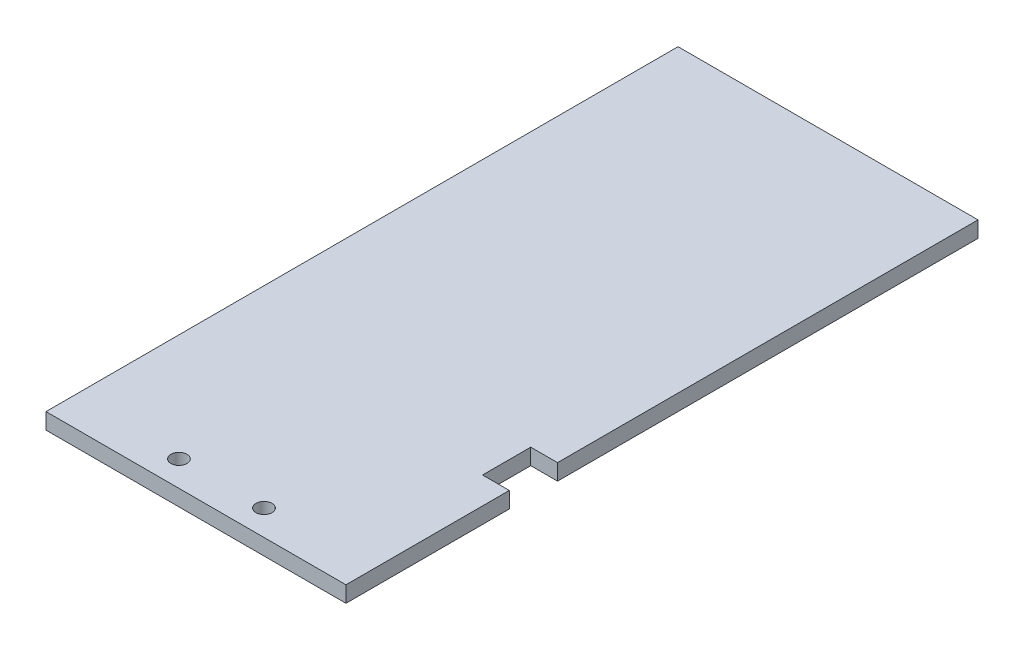
ISO-10303-21;
HEADER;
FILE_DESCRIPTION(('STEP AP214'),'2;1');
FILE_NAME('part.step','',(''),(''),'','','');
FILE_SCHEMA(('AUTOMOTIVE_DESIGN { 1 0 10303 214 1 1 1 1 }'));
ENDSEC;
DATA;
#1=APPLICATION_CONTEXT('core data for automotive mechanical design processes');
#2=APPLICATION_PROTOCOL_DEFINITION('international standard','automotive_design',2000,#1);
#3=PRODUCT_CONTEXT('',#1,'mechanical');
#4=PRODUCT('Part','Part','',(#3));
#5=PRODUCT_RELATED_PRODUCT_CATEGORY('part','',(#4));
#6=PRODUCT_DEFINITION_FORMATION('','',#4);
#7=PRODUCT_DEFINITION_CONTEXT('part definition',#1,'design');
#8=PRODUCT_DEFINITION('design','',#6,#7);
#9=PRODUCT_DEFINITION_SHAPE('','',#8);
#10=(LENGTH_UNIT() NAMED_UNIT(*) SI_UNIT(.MILLI.,.METRE.));
#11=(NAMED_UNIT(*) PLANE_ANGLE_UNIT() SI_UNIT($,.RADIAN.));
#12=(NAMED_UNIT(*) SI_UNIT($,.STERADIAN.) SOLID_ANGLE_UNIT());
#13=UNCERTAINTY_MEASURE_WITH_UNIT(LENGTH_MEASURE(1.E-05),#10,'distance_accuracy_value','');
#14=(GEOMETRIC_REPRESENTATION_CONTEXT(3) GLOBAL_UNCERTAINTY_ASSIGNED_CONTEXT((#13)) GLOBAL_UNIT_ASSIGNED_CONTEXT((#10,
#11,#12)) REPRESENTATION_CONTEXT('',''));
#15=CARTESIAN_POINT('',(0.,0.,0.));
#16=DIRECTION('',(0.,0.,1.));
#17=DIRECTION('',(1.,0.,0.));
#18=AXIS2_PLACEMENT_3D('',#15,#16,#17);
#19=CARTESIAN_POINT('',(56.,3.,0.));
#20=DIRECTION('',(-1.,0.,0.));
#21=DIRECTION('',(0.,0.,1.));
#22=AXIS2_PLACEMENT_3D('',#19,#20,#21);
#23=PLANE('',#22);
#24=DIRECTION('',(0.,0.,-1.));
#25=VECTOR('',#24,1.);
#26=CARTESIAN_POINT('',(56.,3.,0.));
#27=LINE('',#26,#25);
#28=CARTESIAN_POINT('',(56.,3.,-19.5));
#29=VERTEX_POINT('',#28);
#30=CARTESIAN_POINT('',(56.,3.,-98.));
#31=VERTEX_POINT('',#30);
#32=EDGE_CURVE('E151',#29,#31,#27,.T.);
#33=ORIENTED_EDGE('',*,*,#32,.F.);
#34=DIRECTION('',(0.,1.,0.));
#35=VECTOR('',#34,1.);
#36=CARTESIAN_POINT('',(56.,-7.,-19.5));
#37=LINE('',#36,#35);
#38=CARTESIAN_POINT('',(56.,0.,-19.5));
#39=VERTEX_POINT('',#38);
#40=EDGE_CURVE('E141',#39,#29,#37,.T.);
#41=ORIENTED_EDGE('',*,*,#40,.F.);
#42=DIRECTION('',(0.,0.,-1.));
#43=VECTOR('',#42,1.);
#44=CARTESIAN_POINT('',(56.,0.,0.));
#45=LINE('',#44,#43);
#46=CARTESIAN_POINT('',(56.,0.,-98.));
#47=VERTEX_POINT('',#46);
#48=EDGE_CURVE('E99',#39,#47,#45,.T.);
#49=ORIENTED_EDGE('',*,*,#48,.T.);
#50=DIRECTION('',(0.,-1.,0.));
#51=VECTOR('',#50,1.);
#52=CARTESIAN_POINT('',(56.,3.,-98.));
#53=LINE('',#52,#51);
#54=EDGE_CURVE('E79',#31,#47,#53,.T.);
#55=ORIENTED_EDGE('',*,*,#54,.F.);
#56=EDGE_LOOP('',(#33,#41,#49,#55));
#57=FACE_BOUND('',#56,.T.);
#58=ADVANCED_FACE('F34',(#57),#23,.F.);
#59=CARTESIAN_POINT('',(0.,3.,0.));
#60=DIRECTION('',(1.,0.,0.));
#61=DIRECTION('',(0.,0.,-1.));
#62=AXIS2_PLACEMENT_3D('',#59,#60,#61);
#63=PLANE('',#62);
#64=DIRECTION('',(0.,0.,1.));
#65=VECTOR('',#64,1.);
#66=CARTESIAN_POINT('',(0.,0.,0.));
#67=LINE('',#66,#65);
#68=CARTESIAN_POINT('',(0.,0.,-98.));
#69=VERTEX_POINT('',#68);
#70=CARTESIAN_POINT('',(0.,0.,20.));
#71=VERTEX_POINT('',#70);
#72=EDGE_CURVE('E90',#69,#71,#67,.T.);
#73=ORIENTED_EDGE('',*,*,#72,.T.);
#74=DIRECTION('',(0.,-1.,0.));
#75=VECTOR('',#74,1.);
#76=CARTESIAN_POINT('',(0.,0.,20.));
#77=LINE('',#76,#75);
#78=CARTESIAN_POINT('',(0.,3.,20.));
#79=VERTEX_POINT('',#78);
#80=EDGE_CURVE('E140',#79,#71,#77,.T.);
#81=ORIENTED_EDGE('',*,*,#80,.F.);
#82=DIRECTION('',(0.,0.,1.));
#83=VECTOR('',#82,1.);
#84=CARTESIAN_POINT('',(0.,3.,0.));
#85=LINE('',#84,#83);
#86=CARTESIAN_POINT('',(0.,3.,-98.));
#87=VERTEX_POINT('',#86);
#88=EDGE_CURVE('E83',#87,#79,#85,.T.);
#89=ORIENTED_EDGE('',*,*,#88,.F.);
#90=DIRECTION('',(0.,-1.,0.));
#91=VECTOR('',#90,1.);
#92=CARTESIAN_POINT('',(0.,3.,-98.));
#93=LINE('',#92,#91);
#94=EDGE_CURVE('E76',#87,#69,#93,.T.);
#95=ORIENTED_EDGE('',*,*,#94,.T.);
#96=EDGE_LOOP('',(#73,#81,#89,#95));
#97=FACE_BOUND('',#96,.T.);
#98=ADVANCED_FACE('F36',(#97),#63,.F.);
#99=CARTESIAN_POINT('',(56.,0.,20.));
#100=VERTEX_POINT('',#99);
#101=CARTESIAN_POINT('',(56.,0.,-10.5));
#102=VERTEX_POINT('',#101);
#103=EDGE_CURVE('E84',#100,#102,#45,.T.);
#104=ORIENTED_EDGE('',*,*,#103,.T.);
#105=DIRECTION('',(0.,1.,0.));
#106=VECTOR('',#105,1.);
#107=CARTESIAN_POINT('',(56.,-7.,-10.5));
#108=LINE('',#107,#106);
#109=CARTESIAN_POINT('',(56.,3.,-10.5));
#110=VERTEX_POINT('',#109);
#111=EDGE_CURVE('E51',#102,#110,#108,.T.);
#112=ORIENTED_EDGE('',*,*,#111,.T.);
#113=CARTESIAN_POINT('',(56.,3.,20.));
#114=VERTEX_POINT('',#113);
#115=EDGE_CURVE('E152',#114,#110,#27,.T.);
#116=ORIENTED_EDGE('',*,*,#115,.F.);
#117=DIRECTION('',(0.,1.,0.));
#118=VECTOR('',#117,1.);
#119=CARTESIAN_POINT('',(56.,0.,20.));
#120=LINE('',#119,#118);
#121=EDGE_CURVE('E104',#100,#114,#120,.T.);
#122=ORIENTED_EDGE('',*,*,#121,.F.);
#123=EDGE_LOOP('',(#104,#112,#116,#122));
#124=FACE_BOUND('',#123,.T.);
#125=ADVANCED_FACE('F185',(#124),#23,.F.);
#126=CARTESIAN_POINT('',(0.,3.,-98.));
#127=DIRECTION('',(0.,0.,1.));
#128=DIRECTION('',(1.,0.,0.));
#129=AXIS2_PLACEMENT_3D('',#126,#127,#128);
#130=PLANE('',#129);
#131=DIRECTION('',(-1.,0.,0.));
#132=VECTOR('',#131,1.);
#133=CARTESIAN_POINT('',(0.,0.,-98.));
#134=LINE('',#133,#132);
#135=EDGE_CURVE('E73',#47,#69,#134,.T.);
#136=ORIENTED_EDGE('',*,*,#135,.T.);
#137=ORIENTED_EDGE('',*,*,#94,.F.);
#138=DIRECTION('',(-1.,0.,0.));
#139=VECTOR('',#138,1.);
#140=CARTESIAN_POINT('',(0.,3.,-98.));
#141=LINE('',#140,#139);
#142=EDGE_CURVE('E60',#31,#87,#141,.T.);
#143=ORIENTED_EDGE('',*,*,#142,.F.);
#144=ORIENTED_EDGE('',*,*,#54,.T.);
#145=EDGE_LOOP('',(#136,#137,#143,#144));
#146=FACE_BOUND('',#145,.T.);
#147=ADVANCED_FACE('F75',(#146),#130,.F.);
#148=CARTESIAN_POINT('',(0.,3.,0.));
#149=DIRECTION('',(0.,-1.,0.));
#150=DIRECTION('',(0.,0.,-1.));
#151=AXIS2_PLACEMENT_3D('',#148,#149,#150);
#152=PLANE('',#151);
#153=CARTESIAN_POINT('',(20.06,3.,15.24));
#154=DIRECTION('',(0.,1.,0.));
#155=DIRECTION('',(0.,0.,1.));
#156=AXIS2_PLACEMENT_3D('',#153,#154,#155);
#157=CIRCLE('',#156,1.5);
#158=CARTESIAN_POINT('',(20.06,3.,16.74));
#159=VERTEX_POINT('',#158);
#160=EDGE_CURVE('E116',#159,#159,#157,.T.);
#161=ORIENTED_EDGE('',*,*,#160,.F.);
#162=EDGE_LOOP('',(#161));
#163=FACE_BOUND('',#162,.T.);
#164=CARTESIAN_POINT('',(35.94,3.,15.24));
#165=DIRECTION('',(0.,1.,0.));
#166=DIRECTION('',(0.,0.,-1.));
#167=AXIS2_PLACEMENT_3D('',#164,#165,#166);
#168=CIRCLE('',#167,1.5);
#169=CARTESIAN_POINT('',(35.94,3.,13.74));
#170=VERTEX_POINT('',#169);
#171=EDGE_CURVE('E122',#170,#170,#168,.T.);
#172=ORIENTED_EDGE('',*,*,#171,.F.);
#173=EDGE_LOOP('',(#172));
#174=FACE_BOUND('',#173,.T.);
#175=DIRECTION('',(0.,0.,1.));
#176=VECTOR('',#175,1.);
#177=CARTESIAN_POINT('',(51.,3.,-10.5));
#178=LINE('',#177,#176);
#179=CARTESIAN_POINT('',(51.,3.,-19.5));
#180=VERTEX_POINT('',#179);
#181=CARTESIAN_POINT('',(51.,3.,-10.5));
#182=VERTEX_POINT('',#181);
#183=EDGE_CURVE('E120',#180,#182,#178,.T.);
#184=ORIENTED_EDGE('',*,*,#183,.F.);
#185=DIRECTION('',(-1.,0.,0.));
#186=VECTOR('',#185,1.);
#187=CARTESIAN_POINT('',(51.,3.,-19.5));
#188=LINE('',#187,#186);
#189=EDGE_CURVE('E133',#29,#180,#188,.T.);
#190=ORIENTED_EDGE('',*,*,#189,.F.);
#191=ORIENTED_EDGE('',*,*,#32,.T.);
#192=ORIENTED_EDGE('',*,*,#142,.T.);
#193=ORIENTED_EDGE('',*,*,#88,.T.);
#194=DIRECTION('',(-1.,0.,0.));
#195=VECTOR('',#194,1.);
#196=CARTESIAN_POINT('',(0.,3.,20.));
#197=LINE('',#196,#195);
#198=EDGE_CURVE('E100',#114,#79,#197,.T.);
#199=ORIENTED_EDGE('',*,*,#198,.F.);
#200=ORIENTED_EDGE('',*,*,#115,.T.);
#201=DIRECTION('',(1.,0.,0.));
#202=VECTOR('',#201,1.);
#203=CARTESIAN_POINT('',(51.,3.,-10.5));
#204=LINE('',#203,#202);
#205=EDGE_CURVE('E131',#182,#110,#204,.T.);
#206=ORIENTED_EDGE('',*,*,#205,.F.);
#207=EDGE_LOOP('',(#184,#190,#191,#192,#193,#199,#200,#206));
#208=FACE_BOUND('',#207,.T.);
#209=ADVANCED_FACE('F161',(#163,#174,#208),#152,.F.);
#210=CARTESIAN_POINT('',(0.,0.,0.));
#211=DIRECTION('',(0.,-1.,0.));
#212=DIRECTION('',(0.,0.,-1.));
#213=AXIS2_PLACEMENT_3D('',#210,#211,#212);
#214=PLANE('',#213);
#215=CARTESIAN_POINT('',(20.06,0.,15.24));
#216=DIRECTION('',(0.,-1.,0.));
#217=DIRECTION('',(0.,0.,-1.));
#218=AXIS2_PLACEMENT_3D('',#215,#216,#217);
#219=CIRCLE('',#218,1.5);
#220=CARTESIAN_POINT('',(20.06,0.,13.74));
#221=VERTEX_POINT('',#220);
#222=EDGE_CURVE('E38',#221,#221,#219,.T.);
#223=ORIENTED_EDGE('',*,*,#222,.F.);
#224=EDGE_LOOP('',(#223));
#225=FACE_BOUND('',#224,.T.);
#226=CARTESIAN_POINT('',(35.94,0.,15.24));
#227=DIRECTION('',(0.,-1.,0.));
#228=DIRECTION('',(0.,0.,-1.));
#229=AXIS2_PLACEMENT_3D('',#226,#227,#228);
#230=CIRCLE('',#229,1.5);
#231=CARTESIAN_POINT('',(35.94,0.,13.74));
#232=VERTEX_POINT('',#231);
#233=EDGE_CURVE('E114',#232,#232,#230,.T.);
#234=ORIENTED_EDGE('',*,*,#233,.F.);
#235=EDGE_LOOP('',(#234));
#236=FACE_BOUND('',#235,.T.);
#237=DIRECTION('',(1.,0.,0.));
#238=VECTOR('',#237,1.);
#239=CARTESIAN_POINT('',(0.,0.,-19.5));
#240=LINE('',#239,#238);
#241=CARTESIAN_POINT('',(51.,0.,-19.5));
#242=VERTEX_POINT('',#241);
#243=EDGE_CURVE('E11',#242,#39,#240,.T.);
#244=ORIENTED_EDGE('',*,*,#243,.F.);
#245=DIRECTION('',(0.,0.,-1.));
#246=VECTOR('',#245,1.);
#247=CARTESIAN_POINT('',(51.,0.,0.));
#248=LINE('',#247,#246);
#249=CARTESIAN_POINT('',(51.,0.,-10.5));
#250=VERTEX_POINT('',#249);
#251=EDGE_CURVE('E43',#250,#242,#248,.T.);
#252=ORIENTED_EDGE('',*,*,#251,.F.);
#253=DIRECTION('',(-1.,0.,0.));
#254=VECTOR('',#253,1.);
#255=CARTESIAN_POINT('',(0.,0.,-10.5));
#256=LINE('',#255,#254);
#257=EDGE_CURVE('E111',#102,#250,#256,.T.);
#258=ORIENTED_EDGE('',*,*,#257,.F.);
#259=ORIENTED_EDGE('',*,*,#103,.F.);
#260=DIRECTION('',(1.,0.,0.));
#261=VECTOR('',#260,1.);
#262=CARTESIAN_POINT('',(0.,0.,20.));
#263=LINE('',#262,#261);
#264=EDGE_CURVE('E97',#71,#100,#263,.T.);
#265=ORIENTED_EDGE('',*,*,#264,.F.);
#266=ORIENTED_EDGE('',*,*,#72,.F.);
#267=ORIENTED_EDGE('',*,*,#135,.F.);
#268=ORIENTED_EDGE('',*,*,#48,.F.);
#269=EDGE_LOOP('',(#244,#252,#258,#259,#265,#266,#267,#268));
#270=FACE_BOUND('',#269,.T.);
#271=ADVANCED_FACE('F94',(#225,#236,#270),#214,.T.);
#272=CARTESIAN_POINT('',(0.,0.,20.));
#273=DIRECTION('',(0.,0.,-1.));
#274=DIRECTION('',(-1.,0.,0.));
#275=AXIS2_PLACEMENT_3D('',#272,#273,#274);
#276=PLANE('',#275);
#277=ORIENTED_EDGE('',*,*,#80,.T.);
#278=ORIENTED_EDGE('',*,*,#264,.T.);
#279=ORIENTED_EDGE('',*,*,#121,.T.);
#280=ORIENTED_EDGE('',*,*,#198,.T.);
#281=EDGE_LOOP('',(#277,#278,#279,#280));
#282=FACE_BOUND('',#281,.T.);
#283=ADVANCED_FACE('F182',(#282),#276,.F.);
#284=CARTESIAN_POINT('',(51.,-7.,-10.5));
#285=DIRECTION('',(-1.,0.,0.));
#286=DIRECTION('',(0.,0.,1.));
#287=AXIS2_PLACEMENT_3D('',#284,#285,#286);
#288=PLANE('',#287);
#289=ORIENTED_EDGE('',*,*,#251,.T.);
#290=DIRECTION('',(0.,1.,0.));
#291=VECTOR('',#290,1.);
#292=CARTESIAN_POINT('',(51.,-7.,-19.5));
#293=LINE('',#292,#291);
#294=EDGE_CURVE('E137',#242,#180,#293,.T.);
#295=ORIENTED_EDGE('',*,*,#294,.T.);
#296=ORIENTED_EDGE('',*,*,#183,.T.);
#297=DIRECTION('',(0.,1.,0.));
#298=VECTOR('',#297,1.);
#299=CARTESIAN_POINT('',(51.,-7.,-10.5));
#300=LINE('',#299,#298);
#301=EDGE_CURVE('E136',#250,#182,#300,.T.);
#302=ORIENTED_EDGE('',*,*,#301,.F.);
#303=EDGE_LOOP('',(#289,#295,#296,#302));
#304=FACE_BOUND('',#303,.T.);
#305=ADVANCED_FACE('F191',(#304),#288,.F.);
#306=CARTESIAN_POINT('',(51.,-7.,-19.5));
#307=DIRECTION('',(0.,0.,-1.));
#308=DIRECTION('',(-1.,0.,0.));
#309=AXIS2_PLACEMENT_3D('',#306,#307,#308);
#310=PLANE('',#309);
#311=ORIENTED_EDGE('',*,*,#243,.T.);
#312=ORIENTED_EDGE('',*,*,#40,.T.);
#313=ORIENTED_EDGE('',*,*,#189,.T.);
#314=ORIENTED_EDGE('',*,*,#294,.F.);
#315=EDGE_LOOP('',(#311,#312,#313,#314));
#316=FACE_BOUND('',#315,.T.);
#317=ADVANCED_FACE('F193',(#316),#310,.F.);
#318=CARTESIAN_POINT('',(51.,-7.,-10.5));
#319=DIRECTION('',(0.,0.,1.));
#320=DIRECTION('',(1.,0.,0.));
#321=AXIS2_PLACEMENT_3D('',#318,#319,#320);
#322=PLANE('',#321);
#323=ORIENTED_EDGE('',*,*,#257,.T.);
#324=ORIENTED_EDGE('',*,*,#301,.T.);
#325=ORIENTED_EDGE('',*,*,#205,.T.);
#326=ORIENTED_EDGE('',*,*,#111,.F.);
#327=EDGE_LOOP('',(#323,#324,#325,#326));
#328=FACE_BOUND('',#327,.T.);
#329=ADVANCED_FACE('F195',(#328),#322,.F.);
#330=CARTESIAN_POINT('',(35.94,-7.,15.24));
#331=DIRECTION('',(0.,1.,0.));
#332=DIRECTION('',(0.,0.,1.));
#333=AXIS2_PLACEMENT_3D('',#330,#331,#332);
#334=CYLINDRICAL_SURFACE('',#333,1.5);
#335=ORIENTED_EDGE('',*,*,#233,.T.);
#336=EDGE_LOOP('',(#335));
#337=FACE_BOUND('',#336,.T.);
#338=ORIENTED_EDGE('',*,*,#171,.T.);
#339=EDGE_LOOP('',(#338));
#340=FACE_BOUND('',#339,.T.);
#341=ADVANCED_FACE('F201',(#337,#340),#334,.F.);
#342=CARTESIAN_POINT('',(20.06,-7.,15.24));
#343=DIRECTION('',(0.,1.,0.));
#344=DIRECTION('',(0.,0.,1.));
#345=AXIS2_PLACEMENT_3D('',#342,#343,#344);
#346=CYLINDRICAL_SURFACE('',#345,1.5);
#347=ORIENTED_EDGE('',*,*,#222,.T.);
#348=EDGE_LOOP('',(#347));
#349=FACE_BOUND('',#348,.T.);
#350=ORIENTED_EDGE('',*,*,#160,.T.);
#351=EDGE_LOOP('',(#350));
#352=FACE_BOUND('',#351,.T.);
#353=ADVANCED_FACE('F261',(#349,#352),#346,.F.);
#354=CLOSED_SHELL('',(#58,#98,#125,#147,#209,#271,#283,#305,#317,#329,#341,#353));
#355=MANIFOLD_SOLID_BREP('B2',#354);
#356=ADVANCED_BREP_SHAPE_REPRESENTATION('',(#18,#355),#14);
#357=SHAPE_DEFINITION_REPRESENTATION(#9,#356);
ENDSEC;
END-ISO-10303-21;
